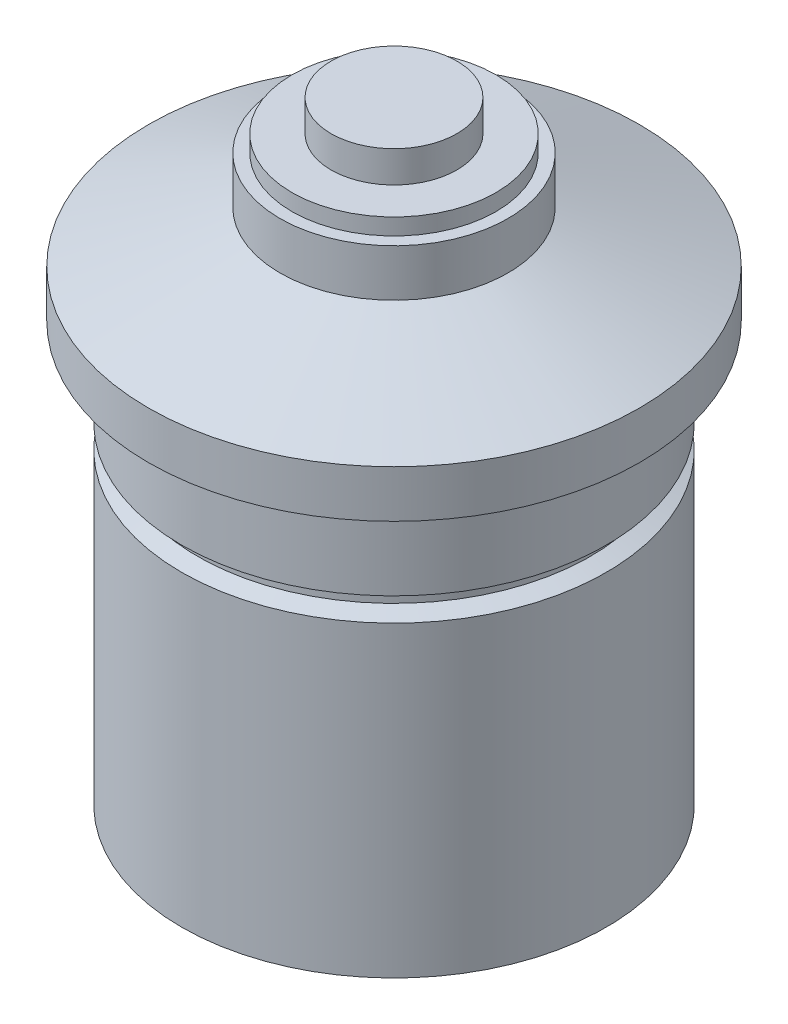
ISO-10303-21;
HEADER;
FILE_DESCRIPTION(('STEP AP214'),'2;1');
FILE_NAME('part.step','',(''),(''),'','','');
FILE_SCHEMA(('AUTOMOTIVE_DESIGN { 1 0 10303 214 1 1 1 1 }'));
ENDSEC;
DATA;
#1=APPLICATION_CONTEXT('core data for automotive mechanical design processes');
#2=APPLICATION_PROTOCOL_DEFINITION('international standard','automotive_design',2000,#1);
#3=PRODUCT_CONTEXT('',#1,'mechanical');
#4=PRODUCT('Part','Part','',(#3));
#5=PRODUCT_RELATED_PRODUCT_CATEGORY('part','',(#4));
#6=PRODUCT_DEFINITION_FORMATION('','',#4);
#7=PRODUCT_DEFINITION_CONTEXT('part definition',#1,'design');
#8=PRODUCT_DEFINITION('design','',#6,#7);
#9=PRODUCT_DEFINITION_SHAPE('','',#8);
#10=(LENGTH_UNIT() NAMED_UNIT(*) SI_UNIT(.MILLI.,.METRE.));
#11=(NAMED_UNIT(*) PLANE_ANGLE_UNIT() SI_UNIT($,.RADIAN.));
#12=(NAMED_UNIT(*) SI_UNIT($,.STERADIAN.) SOLID_ANGLE_UNIT());
#13=UNCERTAINTY_MEASURE_WITH_UNIT(LENGTH_MEASURE(1.E-05),#10,'distance_accuracy_value','');
#14=(GEOMETRIC_REPRESENTATION_CONTEXT(3) GLOBAL_UNCERTAINTY_ASSIGNED_CONTEXT((#13)) GLOBAL_UNIT_ASSIGNED_CONTEXT((#10,
#11,#12)) REPRESENTATION_CONTEXT('',''));
#15=CARTESIAN_POINT('',(0.,0.,0.));
#16=DIRECTION('',(0.,0.,1.));
#17=DIRECTION('',(1.,0.,0.));
#18=AXIS2_PLACEMENT_3D('',#15,#16,#17);
#19=CARTESIAN_POINT('',(0.,42.748,0.));
#20=DIRECTION('',(0.,1.,0.));
#21=DIRECTION('',(0.,0.,1.));
#22=AXIS2_PLACEMENT_3D('',#19,#20,#21);
#23=CYLINDRICAL_SURFACE('',#22,13.5);
#24=CARTESIAN_POINT('',(0.,30.4402056844981,0.));
#25=DIRECTION('',(0.,1.,0.));
#26=DIRECTION('',(0.,0.,1.));
#27=AXIS2_PLACEMENT_3D('',#24,#25,#26);
#28=CIRCLE('',#27,13.5);
#29=CARTESIAN_POINT('',(0.,30.4402056844981,13.5));
#30=VERTEX_POINT('',#29);
#31=EDGE_CURVE('E74',#30,#30,#28,.T.);
#32=ORIENTED_EDGE('',*,*,#31,.F.);
#33=EDGE_LOOP('',(#32));
#34=FACE_BOUND('',#33,.T.);
#35=CARTESIAN_POINT('',(0.,24.8402056844981,0.));
#36=DIRECTION('',(0.,-1.,0.));
#37=DIRECTION('',(0.,0.,-1.));
#38=AXIS2_PLACEMENT_3D('',#35,#36,#37);
#39=CIRCLE('',#38,13.5);
#40=CARTESIAN_POINT('',(0.,24.8402056844981,-13.5));
#41=VERTEX_POINT('',#40);
#42=EDGE_CURVE('E98',#41,#41,#39,.T.);
#43=ORIENTED_EDGE('',*,*,#42,.F.);
#44=EDGE_LOOP('',(#43));
#45=FACE_BOUND('',#44,.T.);
#46=ADVANCED_FACE('F36',(#34,#45),#23,.T.);
#47=CARTESIAN_POINT('',(0.,39.7,0.));
#48=DIRECTION('',(0.,1.,0.));
#49=DIRECTION('',(0.,0.,1.));
#50=AXIS2_PLACEMENT_3D('',#47,#48,#49);
#51=PLANE('',#50);
#52=CARTESIAN_POINT('',(0.,39.7,0.));
#53=DIRECTION('',(0.,1.,0.));
#54=DIRECTION('',(0.,0.,1.));
#55=AXIS2_PLACEMENT_3D('',#52,#53,#54);
#56=CIRCLE('',#55,7.25);
#57=CARTESIAN_POINT('',(0.,39.7,7.25));
#58=VERTEX_POINT('',#57);
#59=EDGE_CURVE('E86',#58,#58,#56,.T.);
#60=ORIENTED_EDGE('',*,*,#59,.T.);
#61=EDGE_LOOP('',(#60));
#62=FACE_BOUND('',#61,.T.);
#63=CARTESIAN_POINT('',(0.,39.7,0.));
#64=DIRECTION('',(0.,1.,0.));
#65=DIRECTION('',(0.,0.,1.));
#66=AXIS2_PLACEMENT_3D('',#63,#64,#65);
#67=CIRCLE('',#66,6.488);
#68=CARTESIAN_POINT('',(0.,39.7,6.488));
#69=VERTEX_POINT('',#68);
#70=EDGE_CURVE('E47',#69,#69,#67,.T.);
#71=ORIENTED_EDGE('',*,*,#70,.F.);
#72=EDGE_LOOP('',(#71));
#73=FACE_BOUND('',#72,.T.);
#74=ADVANCED_FACE('F106',(#62,#73),#51,.T.);
#75=CARTESIAN_POINT('',(0.,42.748,0.));
#76=DIRECTION('',(0.,1.,0.));
#77=DIRECTION('',(0.,0.,1.));
#78=AXIS2_PLACEMENT_3D('',#75,#76,#77);
#79=CYLINDRICAL_SURFACE('',#78,6.488);
#80=ORIENTED_EDGE('',*,*,#70,.T.);
#81=EDGE_LOOP('',(#80));
#82=FACE_BOUND('',#81,.T.);
#83=CARTESIAN_POINT('',(0.,40.748,0.));
#84=DIRECTION('',(0.,1.,0.));
#85=DIRECTION('',(0.,0.,1.));
#86=AXIS2_PLACEMENT_3D('',#83,#84,#85);
#87=CIRCLE('',#86,6.488);
#88=CARTESIAN_POINT('',(0.,40.748,6.488));
#89=VERTEX_POINT('',#88);
#90=EDGE_CURVE('E51',#89,#89,#87,.T.);
#91=ORIENTED_EDGE('',*,*,#90,.F.);
#92=EDGE_LOOP('',(#91));
#93=FACE_BOUND('',#92,.T.);
#94=ADVANCED_FACE('F113',(#82,#93),#79,.T.);
#95=CARTESIAN_POINT('',(0.,40.748,0.));
#96=DIRECTION('',(0.,1.,0.));
#97=DIRECTION('',(0.,0.,1.));
#98=AXIS2_PLACEMENT_3D('',#95,#96,#97);
#99=PLANE('',#98);
#100=ORIENTED_EDGE('',*,*,#90,.T.);
#101=EDGE_LOOP('',(#100));
#102=FACE_BOUND('',#101,.T.);
#103=CARTESIAN_POINT('',(0.,40.748,0.));
#104=DIRECTION('',(0.,1.,0.));
#105=DIRECTION('',(0.,0.,1.));
#106=AXIS2_PLACEMENT_3D('',#103,#104,#105);
#107=CIRCLE('',#106,4.);
#108=CARTESIAN_POINT('',(0.,40.748,4.));
#109=VERTEX_POINT('',#108);
#110=EDGE_CURVE('E56',#109,#109,#107,.T.);
#111=ORIENTED_EDGE('',*,*,#110,.F.);
#112=EDGE_LOOP('',(#111));
#113=FACE_BOUND('',#112,.T.);
#114=ADVANCED_FACE('F178',(#102,#113),#99,.T.);
#115=CARTESIAN_POINT('',(0.,42.748,0.));
#116=DIRECTION('',(0.,1.,0.));
#117=DIRECTION('',(0.,0.,1.));
#118=AXIS2_PLACEMENT_3D('',#115,#116,#117);
#119=CYLINDRICAL_SURFACE('',#118,4.);
#120=CARTESIAN_POINT('',(0.,42.748,0.));
#121=DIRECTION('',(0.,1.,0.));
#122=DIRECTION('',(0.,0.,1.));
#123=AXIS2_PLACEMENT_3D('',#120,#121,#122);
#124=CIRCLE('',#123,4.);
#125=CARTESIAN_POINT('',(0.,42.748,4.));
#126=VERTEX_POINT('',#125);
#127=EDGE_CURVE('E59',#126,#126,#124,.T.);
#128=ORIENTED_EDGE('',*,*,#127,.F.);
#129=EDGE_LOOP('',(#128));
#130=FACE_BOUND('',#129,.T.);
#131=ORIENTED_EDGE('',*,*,#110,.T.);
#132=EDGE_LOOP('',(#131));
#133=FACE_BOUND('',#132,.T.);
#134=ADVANCED_FACE('F162',(#130,#133),#119,.T.);
#135=CARTESIAN_POINT('',(0.,42.748,0.));
#136=DIRECTION('',(0.,-1.,0.));
#137=DIRECTION('',(0.,0.,-1.));
#138=AXIS2_PLACEMENT_3D('',#135,#136,#137);
#139=PLANE('',#138);
#140=ORIENTED_EDGE('',*,*,#127,.T.);
#141=EDGE_LOOP('',(#140));
#142=FACE_BOUND('',#141,.T.);
#143=ADVANCED_FACE('F157',(#142),#139,.F.);
#144=CARTESIAN_POINT('',(0.,30.4402056844981,0.));
#145=DIRECTION('',(0.,-1.,0.));
#146=DIRECTION('',(0.,0.,-1.));
#147=AXIS2_PLACEMENT_3D('',#144,#145,#146);
#148=PLANE('',#147);
#149=ORIENTED_EDGE('',*,*,#31,.T.);
#150=EDGE_LOOP('',(#149));
#151=FACE_BOUND('',#150,.T.);
#152=CARTESIAN_POINT('',(0.,30.4402056844981,0.));
#153=DIRECTION('',(0.,1.,0.));
#154=DIRECTION('',(0.,0.,1.));
#155=AXIS2_PLACEMENT_3D('',#152,#153,#154);
#156=CIRCLE('',#155,15.6125);
#157=CARTESIAN_POINT('',(0.,30.4402056844981,15.6125));
#158=VERTEX_POINT('',#157);
#159=EDGE_CURVE('E77',#158,#158,#156,.T.);
#160=ORIENTED_EDGE('',*,*,#159,.F.);
#161=EDGE_LOOP('',(#160));
#162=FACE_BOUND('',#161,.T.);
#163=ADVANCED_FACE('F154',(#151,#162),#148,.T.);
#164=CARTESIAN_POINT('',(0.,42.748,0.));
#165=DIRECTION('',(0.,1.,0.));
#166=DIRECTION('',(0.,0.,1.));
#167=AXIS2_PLACEMENT_3D('',#164,#165,#166);
#168=CYLINDRICAL_SURFACE('',#167,15.6125);
#169=ORIENTED_EDGE('',*,*,#159,.T.);
#170=EDGE_LOOP('',(#169));
#171=FACE_BOUND('',#170,.T.);
#172=CARTESIAN_POINT('',(0.,33.447007876197,0.));
#173=DIRECTION('',(0.,1.,0.));
#174=DIRECTION('',(0.,0.,1.));
#175=AXIS2_PLACEMENT_3D('',#172,#173,#174);
#176=CIRCLE('',#175,15.6125);
#177=CARTESIAN_POINT('',(0.,33.447007876197,15.6125));
#178=VERTEX_POINT('',#177);
#179=EDGE_CURVE('E80',#178,#178,#176,.T.);
#180=ORIENTED_EDGE('',*,*,#179,.F.);
#181=EDGE_LOOP('',(#180));
#182=FACE_BOUND('',#181,.T.);
#183=ADVANCED_FACE('F151',(#171,#182),#168,.T.);
#184=CARTESIAN_POINT('',(0.,36.7,0.));
#185=DIRECTION('',(0.,-1.,0.));
#186=DIRECTION('',(0.,0.,-1.));
#187=AXIS2_PLACEMENT_3D('',#184,#185,#186);
#188=CONICAL_SURFACE('',#187,7.25,1.19981064322638);
#189=ORIENTED_EDGE('',*,*,#179,.T.);
#190=EDGE_LOOP('',(#189));
#191=FACE_BOUND('',#190,.T.);
#192=CARTESIAN_POINT('',(0.,36.7,0.));
#193=DIRECTION('',(0.,1.,0.));
#194=DIRECTION('',(0.,0.,1.));
#195=AXIS2_PLACEMENT_3D('',#192,#193,#194);
#196=CIRCLE('',#195,7.25);
#197=CARTESIAN_POINT('',(0.,36.7,7.25));
#198=VERTEX_POINT('',#197);
#199=EDGE_CURVE('E83',#198,#198,#196,.T.);
#200=ORIENTED_EDGE('',*,*,#199,.F.);
#201=EDGE_LOOP('',(#200));
#202=FACE_BOUND('',#201,.T.);
#203=ADVANCED_FACE('F144',(#191,#202),#188,.T.);
#204=CARTESIAN_POINT('',(0.,42.748,0.));
#205=DIRECTION('',(0.,1.,0.));
#206=DIRECTION('',(0.,0.,1.));
#207=AXIS2_PLACEMENT_3D('',#204,#205,#206);
#208=CYLINDRICAL_SURFACE('',#207,7.25);
#209=ORIENTED_EDGE('',*,*,#199,.T.);
#210=EDGE_LOOP('',(#209));
#211=FACE_BOUND('',#210,.T.);
#212=ORIENTED_EDGE('',*,*,#59,.F.);
#213=EDGE_LOOP('',(#212));
#214=FACE_BOUND('',#213,.T.);
#215=ADVANCED_FACE('F135',(#211,#214),#208,.T.);
#216=CARTESIAN_POINT('',(0.,23.3402056844981,0.));
#217=DIRECTION('',(0.,-1.,0.));
#218=DIRECTION('',(0.,0.,-1.));
#219=AXIS2_PLACEMENT_3D('',#216,#217,#218);
#220=CONICAL_SURFACE('',#219,13.5,1.22242051762608);
#221=CARTESIAN_POINT('',(0.,23.7092056844981,0.));
#222=DIRECTION('',(0.,-1.,0.));
#223=DIRECTION('',(0.,0.,-1.));
#224=AXIS2_PLACEMENT_3D('',#221,#222,#223);
#225=CIRCLE('',#224,12.484);
#226=CARTESIAN_POINT('',(0.,23.7092056844981,-12.484));
#227=VERTEX_POINT('',#226);
#228=EDGE_CURVE('E92',#227,#227,#225,.T.);
#229=ORIENTED_EDGE('',*,*,#228,.T.);
#230=EDGE_LOOP('',(#229));
#231=FACE_BOUND('',#230,.T.);
#232=CARTESIAN_POINT('',(0.,23.3402056844981,0.));
#233=DIRECTION('',(0.,-1.,0.));
#234=DIRECTION('',(0.,0.,-1.));
#235=AXIS2_PLACEMENT_3D('',#232,#233,#234);
#236=CIRCLE('',#235,13.5);
#237=CARTESIAN_POINT('',(0.,23.3402056844981,-13.5));
#238=VERTEX_POINT('',#237);
#239=EDGE_CURVE('E89',#238,#238,#236,.T.);
#240=ORIENTED_EDGE('',*,*,#239,.F.);
#241=EDGE_LOOP('',(#240));
#242=FACE_BOUND('',#241,.T.);
#243=ADVANCED_FACE('F132',(#231,#242),#220,.T.);
#244=CARTESIAN_POINT('',(0.,0.,0.));
#245=DIRECTION('',(0.,-1.,0.));
#246=DIRECTION('',(0.,0.,-1.));
#247=AXIS2_PLACEMENT_3D('',#244,#245,#246);
#248=CYLINDRICAL_SURFACE('',#247,12.484);
#249=CARTESIAN_POINT('',(0.,24.4712056844981,0.));
#250=DIRECTION('',(0.,-1.,0.));
#251=DIRECTION('',(0.,0.,-1.));
#252=AXIS2_PLACEMENT_3D('',#249,#250,#251);
#253=CIRCLE('',#252,12.484);
#254=CARTESIAN_POINT('',(0.,24.4712056844981,-12.484));
#255=VERTEX_POINT('',#254);
#256=EDGE_CURVE('E95',#255,#255,#253,.T.);
#257=ORIENTED_EDGE('',*,*,#256,.T.);
#258=EDGE_LOOP('',(#257));
#259=FACE_BOUND('',#258,.T.);
#260=ORIENTED_EDGE('',*,*,#228,.F.);
#261=EDGE_LOOP('',(#260));
#262=FACE_BOUND('',#261,.T.);
#263=ADVANCED_FACE('F134',(#259,#262),#248,.T.);
#264=CARTESIAN_POINT('',(0.,24.4712056844981,0.));
#265=DIRECTION('',(0.,1.,0.));
#266=DIRECTION('',(0.,0.,1.));
#267=AXIS2_PLACEMENT_3D('',#264,#265,#266);
#268=CONICAL_SURFACE('',#267,12.484,1.22242051762608);
#269=ORIENTED_EDGE('',*,*,#42,.T.);
#270=EDGE_LOOP('',(#269));
#271=FACE_BOUND('',#270,.T.);
#272=ORIENTED_EDGE('',*,*,#256,.F.);
#273=EDGE_LOOP('',(#272));
#274=FACE_BOUND('',#273,.T.);
#275=ADVANCED_FACE('F102',(#271,#274),#268,.T.);
#276=CARTESIAN_POINT('',(0.,0.,0.));
#277=DIRECTION('',(0.,-1.,0.));
#278=DIRECTION('',(0.,0.,-1.));
#279=AXIS2_PLACEMENT_3D('',#276,#277,#278);
#280=PLANE('',#279);
#281=CARTESIAN_POINT('',(0.,0.,0.));
#282=DIRECTION('',(0.,1.,0.));
#283=DIRECTION('',(0.,0.,1.));
#284=AXIS2_PLACEMENT_3D('',#281,#282,#283);
#285=CIRCLE('',#284,7.71000000000001);
#286=CARTESIAN_POINT('',(0.,0.,7.71000000000001));
#287=VERTEX_POINT('',#286);
#288=EDGE_CURVE('E62',#287,#287,#285,.T.);
#289=ORIENTED_EDGE('',*,*,#288,.F.);
#290=EDGE_LOOP('',(#289));
#291=FACE_BOUND('',#290,.T.);
#292=ADVANCED_FACE('F194',(#291),#280,.T.);
#293=CARTESIAN_POINT('',(0.,42.748,0.));
#294=DIRECTION('',(0.,1.,0.));
#295=DIRECTION('',(0.,0.,1.));
#296=AXIS2_PLACEMENT_3D('',#293,#294,#295);
#297=CYLINDRICAL_SURFACE('',#296,7.71000000000001);
#298=ORIENTED_EDGE('',*,*,#288,.T.);
#299=EDGE_LOOP('',(#298));
#300=FACE_BOUND('',#299,.T.);
#301=CARTESIAN_POINT('',(0.,2.8,0.));
#302=DIRECTION('',(0.,1.,0.));
#303=DIRECTION('',(0.,0.,1.));
#304=AXIS2_PLACEMENT_3D('',#301,#302,#303);
#305=CIRCLE('',#304,7.71000000000001);
#306=CARTESIAN_POINT('',(0.,2.8,7.71000000000001));
#307=VERTEX_POINT('',#306);
#308=EDGE_CURVE('E65',#307,#307,#305,.T.);
#309=ORIENTED_EDGE('',*,*,#308,.F.);
#310=EDGE_LOOP('',(#309));
#311=FACE_BOUND('',#310,.T.);
#312=ADVANCED_FACE('F197',(#300,#311),#297,.T.);
#313=CARTESIAN_POINT('',(0.,2.8,0.));
#314=DIRECTION('',(0.,-1.,0.));
#315=DIRECTION('',(0.,0.,-1.));
#316=AXIS2_PLACEMENT_3D('',#313,#314,#315);
#317=PLANE('',#316);
#318=CARTESIAN_POINT('',(0.,2.8,0.));
#319=DIRECTION('',(0.,-1.,0.));
#320=DIRECTION('',(0.,0.,-1.));
#321=AXIS2_PLACEMENT_3D('',#318,#319,#320);
#322=CIRCLE('',#321,8.492);
#323=CARTESIAN_POINT('',(0.,2.8,-8.492));
#324=VERTEX_POINT('',#323);
#325=EDGE_CURVE('E10',#324,#324,#322,.T.);
#326=ORIENTED_EDGE('',*,*,#325,.T.);
#327=EDGE_LOOP('',(#326));
#328=FACE_BOUND('',#327,.T.);
#329=ORIENTED_EDGE('',*,*,#308,.T.);
#330=EDGE_LOOP('',(#329));
#331=FACE_BOUND('',#330,.T.);
#332=ADVANCED_FACE('F201',(#328,#331),#317,.T.);
#333=CARTESIAN_POINT('',(0.,42.748,0.));
#334=DIRECTION('',(0.,1.,0.));
#335=DIRECTION('',(0.,0.,1.));
#336=AXIS2_PLACEMENT_3D('',#333,#334,#335);
#337=CYLINDRICAL_SURFACE('',#336,9.00000000000001);
#338=CARTESIAN_POINT('',(0.,3.30800000000001,0.));
#339=DIRECTION('',(0.,-1.,0.));
#340=DIRECTION('',(0.,0.,-1.));
#341=AXIS2_PLACEMENT_3D('',#338,#339,#340);
#342=CIRCLE('',#341,9.00000000000001);
#343=CARTESIAN_POINT('',(0.,3.30800000000001,-9.00000000000001));
#344=VERTEX_POINT('',#343);
#345=EDGE_CURVE('E43',#344,#344,#342,.F.);
#346=ORIENTED_EDGE('',*,*,#345,.T.);
#347=EDGE_LOOP('',(#346));
#348=FACE_BOUND('',#347,.T.);
#349=CARTESIAN_POINT('',(0.,3.8,0.));
#350=DIRECTION('',(0.,1.,0.));
#351=DIRECTION('',(0.,0.,1.));
#352=AXIS2_PLACEMENT_3D('',#349,#350,#351);
#353=CIRCLE('',#352,9.00000000000001);
#354=CARTESIAN_POINT('',(0.,3.8,9.00000000000001));
#355=VERTEX_POINT('',#354);
#356=EDGE_CURVE('E68',#355,#355,#353,.T.);
#357=ORIENTED_EDGE('',*,*,#356,.F.);
#358=EDGE_LOOP('',(#357));
#359=FACE_BOUND('',#358,.T.);
#360=ADVANCED_FACE('F126',(#348,#359),#337,.T.);
#361=CARTESIAN_POINT('',(0.,3.80000000000001,0.));
#362=DIRECTION('',(0.,-1.,0.));
#363=DIRECTION('',(0.,0.,-1.));
#364=AXIS2_PLACEMENT_3D('',#361,#362,#363);
#365=PLANE('',#364);
#366=ORIENTED_EDGE('',*,*,#356,.T.);
#367=EDGE_LOOP('',(#366));
#368=FACE_BOUND('',#367,.T.);
#369=CARTESIAN_POINT('',(0.,3.80000000000001,0.));
#370=DIRECTION('',(0.,1.,0.));
#371=DIRECTION('',(0.,0.,1.));
#372=AXIS2_PLACEMENT_3D('',#369,#370,#371);
#373=CIRCLE('',#372,13.5);
#374=CARTESIAN_POINT('',(0.,3.80000000000001,13.5));
#375=VERTEX_POINT('',#374);
#376=EDGE_CURVE('E71',#375,#375,#373,.T.);
#377=ORIENTED_EDGE('',*,*,#376,.F.);
#378=EDGE_LOOP('',(#377));
#379=FACE_BOUND('',#378,.T.);
#380=ADVANCED_FACE('F119',(#368,#379),#365,.T.);
#381=ORIENTED_EDGE('',*,*,#376,.T.);
#382=EDGE_LOOP('',(#381));
#383=FACE_BOUND('',#382,.T.);
#384=ORIENTED_EDGE('',*,*,#239,.T.);
#385=EDGE_LOOP('',(#384));
#386=FACE_BOUND('',#385,.T.);
#387=ADVANCED_FACE('F109',(#383,#386),#23,.T.);
#388=CARTESIAN_POINT('',(0.,3.30800000000001,0.));
#389=DIRECTION('',(0.,-1.,0.));
#390=DIRECTION('',(0.,0.,-1.));
#391=AXIS2_PLACEMENT_3D('',#388,#389,#390);
#392=TOROIDAL_SURFACE('',#391,8.492,0.508);
#393=ORIENTED_EDGE('',*,*,#325,.F.);
#394=EDGE_LOOP('',(#393));
#395=FACE_BOUND('',#394,.T.);
#396=ORIENTED_EDGE('',*,*,#345,.F.);
#397=EDGE_LOOP('',(#396));
#398=FACE_BOUND('',#397,.T.);
#399=ADVANCED_FACE('F38',(#395,#398),#392,.T.);
#400=CLOSED_SHELL('',(#46,#74,#94,#114,#134,#143,#163,#183,#203,#215,#243,#263,#275,#292,#312,
#332,#360,#380,#387,#399));
#401=MANIFOLD_SOLID_BREP('B2',#400);
#402=ADVANCED_BREP_SHAPE_REPRESENTATION('',(#18,#401),#14);
#403=SHAPE_DEFINITION_REPRESENTATION(#9,#402);
ENDSEC;
END-ISO-10303-21;
